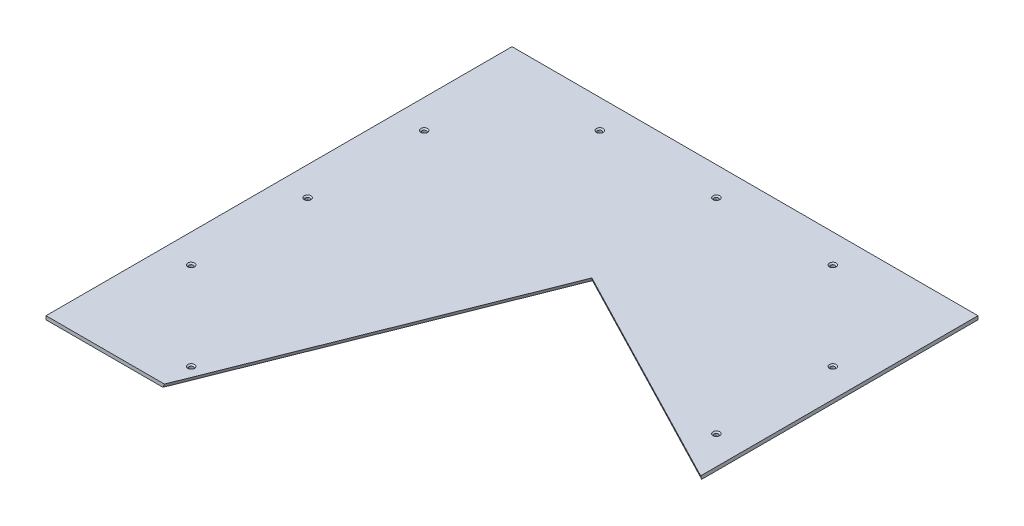
ISO-10303-21;
HEADER;
FILE_DESCRIPTION(('STEP AP214'),'2;1');
FILE_NAME('part.step','',(''),(''),'','','');
FILE_SCHEMA(('AUTOMOTIVE_DESIGN { 1 0 10303 214 1 1 1 1 }'));
ENDSEC;
DATA;
#1=APPLICATION_CONTEXT('core data for automotive mechanical design processes');
#2=APPLICATION_PROTOCOL_DEFINITION('international standard','automotive_design',2000,#1);
#3=PRODUCT_CONTEXT('',#1,'mechanical');
#4=PRODUCT('Part','Part','',(#3));
#5=PRODUCT_RELATED_PRODUCT_CATEGORY('part','',(#4));
#6=PRODUCT_DEFINITION_FORMATION('','',#4);
#7=PRODUCT_DEFINITION_CONTEXT('part definition',#1,'design');
#8=PRODUCT_DEFINITION('design','',#6,#7);
#9=PRODUCT_DEFINITION_SHAPE('','',#8);
#10=(LENGTH_UNIT() NAMED_UNIT(*) SI_UNIT(.MILLI.,.METRE.));
#11=(NAMED_UNIT(*) PLANE_ANGLE_UNIT() SI_UNIT($,.RADIAN.));
#12=(NAMED_UNIT(*) SI_UNIT($,.STERADIAN.) SOLID_ANGLE_UNIT());
#13=UNCERTAINTY_MEASURE_WITH_UNIT(LENGTH_MEASURE(1.E-05),#10,'distance_accuracy_value','');
#14=(GEOMETRIC_REPRESENTATION_CONTEXT(3) GLOBAL_UNCERTAINTY_ASSIGNED_CONTEXT((#13)) GLOBAL_UNIT_ASSIGNED_CONTEXT((#10,
#11,#12)) REPRESENTATION_CONTEXT('',''));
#15=CARTESIAN_POINT('',(0.,0.,0.));
#16=DIRECTION('',(0.,0.,1.));
#17=DIRECTION('',(1.,0.,0.));
#18=AXIS2_PLACEMENT_3D('',#15,#16,#17);
#19=CARTESIAN_POINT('',(103.375714,114.488214,103.375714));
#20=DIRECTION('',(1.,0.,0.));
#21=DIRECTION('',(0.,0.,1.));
#22=AXIS2_PLACEMENT_3D('',#19,#20,#21);
#23=PLANE('',#22);
#24=DIRECTION('',(0.,0.,1.));
#25=VECTOR('',#24,1.);
#26=CARTESIAN_POINT('',(103.375714,114.488214,103.375714));
#27=LINE('',#26,#25);
#28=CARTESIAN_POINT('',(103.375714,114.488214,-103.375714));
#29=VERTEX_POINT('',#28);
#30=CARTESIAN_POINT('',(103.375714,114.488214,19.666163495608));
#31=VERTEX_POINT('',#30);
#32=EDGE_CURVE('E193',#29,#31,#27,.T.);
#33=ORIENTED_EDGE('',*,*,#32,.T.);
#34=DIRECTION('',(0.,-0.961632224178945,-0.274341876899344));
#35=VECTOR('',#34,1.);
#36=CARTESIAN_POINT('',(103.375714,136.572131877508,25.9664343553739));
#37=LINE('',#36,#35);
#38=CARTESIAN_POINT('',(103.375714,112.900714,19.2132692199928));
#39=VERTEX_POINT('',#38);
#40=EDGE_CURVE('E95',#31,#39,#37,.T.);
#41=ORIENTED_EDGE('',*,*,#40,.T.);
#42=DIRECTION('',(0.,0.,1.));
#43=VECTOR('',#42,1.);
#44=CARTESIAN_POINT('',(103.375714,112.900714,103.375714));
#45=LINE('',#44,#43);
#46=CARTESIAN_POINT('',(103.375714,112.900714,-103.375714));
#47=VERTEX_POINT('',#46);
#48=EDGE_CURVE('E192',#47,#39,#45,.T.);
#49=ORIENTED_EDGE('',*,*,#48,.F.);
#50=DIRECTION('',(0.,-1.,0.));
#51=VECTOR('',#50,1.);
#52=CARTESIAN_POINT('',(103.375714,114.488214,-103.375714));
#53=LINE('',#52,#51);
#54=EDGE_CURVE('E55',#29,#47,#53,.T.);
#55=ORIENTED_EDGE('',*,*,#54,.F.);
#56=EDGE_LOOP('',(#33,#41,#49,#55));
#57=FACE_BOUND('',#56,.T.);
#58=ADVANCED_FACE('F32',(#57),#23,.T.);
#59=CARTESIAN_POINT('',(103.375714,114.488214,-103.375714));
#60=DIRECTION('',(0.,0.,-1.));
#61=DIRECTION('',(1.,0.,0.));
#62=AXIS2_PLACEMENT_3D('',#59,#60,#61);
#63=PLANE('',#62);
#64=DIRECTION('',(1.,0.,0.));
#65=VECTOR('',#64,1.);
#66=CARTESIAN_POINT('',(103.375714,112.900714,-103.375714));
#67=LINE('',#66,#65);
#68=CARTESIAN_POINT('',(-103.375714,112.900714,-103.375714));
#69=VERTEX_POINT('',#68);
#70=EDGE_CURVE('E195',#69,#47,#67,.T.);
#71=ORIENTED_EDGE('',*,*,#70,.F.);
#72=DIRECTION('',(0.,-1.,0.));
#73=VECTOR('',#72,1.);
#74=CARTESIAN_POINT('',(-103.375714,114.488214,-103.375714));
#75=LINE('',#74,#73);
#76=CARTESIAN_POINT('',(-103.375714,114.488214,-103.375714));
#77=VERTEX_POINT('',#76);
#78=EDGE_CURVE('E213',#77,#69,#75,.T.);
#79=ORIENTED_EDGE('',*,*,#78,.F.);
#80=DIRECTION('',(1.,0.,0.));
#81=VECTOR('',#80,1.);
#82=CARTESIAN_POINT('',(103.375714,114.488214,-103.375714));
#83=LINE('',#82,#81);
#84=EDGE_CURVE('E200',#77,#29,#83,.T.);
#85=ORIENTED_EDGE('',*,*,#84,.T.);
#86=ORIENTED_EDGE('',*,*,#54,.T.);
#87=EDGE_LOOP('',(#71,#79,#85,#86));
#88=FACE_BOUND('',#87,.T.);
#89=ADVANCED_FACE('F219',(#88),#63,.T.);
#90=CARTESIAN_POINT('',(-103.375714,114.488214,103.375714));
#91=DIRECTION('',(-1.,0.,0.));
#92=DIRECTION('',(0.,0.,-1.));
#93=AXIS2_PLACEMENT_3D('',#90,#91,#92);
#94=PLANE('',#93);
#95=DIRECTION('',(0.,0.,-1.));
#96=VECTOR('',#95,1.);
#97=CARTESIAN_POINT('',(-103.375714,112.900714,103.375714));
#98=LINE('',#97,#96);
#99=CARTESIAN_POINT('',(-103.375714,112.900714,103.375714));
#100=VERTEX_POINT('',#99);
#101=EDGE_CURVE('E207',#100,#69,#98,.T.);
#102=ORIENTED_EDGE('',*,*,#101,.F.);
#103=DIRECTION('',(0.,-1.,0.));
#104=VECTOR('',#103,1.);
#105=CARTESIAN_POINT('',(-103.375714,114.488214,103.375714));
#106=LINE('',#105,#104);
#107=CARTESIAN_POINT('',(-103.375714,114.488214,103.375714));
#108=VERTEX_POINT('',#107);
#109=EDGE_CURVE('E202',#108,#100,#106,.T.);
#110=ORIENTED_EDGE('',*,*,#109,.F.);
#111=DIRECTION('',(0.,0.,-1.));
#112=VECTOR('',#111,1.);
#113=CARTESIAN_POINT('',(-103.375714,114.488214,103.375714));
#114=LINE('',#113,#112);
#115=EDGE_CURVE('E197',#108,#77,#114,.T.);
#116=ORIENTED_EDGE('',*,*,#115,.T.);
#117=ORIENTED_EDGE('',*,*,#78,.T.);
#118=EDGE_LOOP('',(#102,#110,#116,#117));
#119=FACE_BOUND('',#118,.T.);
#120=ADVANCED_FACE('F222',(#119),#94,.T.);
#121=CARTESIAN_POINT('',(103.375714,114.488214,103.375714));
#122=DIRECTION('',(0.,0.,1.));
#123=DIRECTION('',(-1.,0.,0.));
#124=AXIS2_PLACEMENT_3D('',#121,#122,#123);
#125=PLANE('',#124);
#126=DIRECTION('',(-0.386214206739788,-0.922409121004534,0.));
#127=VECTOR('',#126,1.);
#128=CARTESIAN_POINT('',(-27.8368800868292,169.427141625007,103.375714));
#129=LINE('',#128,#127);
#130=CARTESIAN_POINT('',(-50.8398988869029,114.488214,103.375714));
#131=VERTEX_POINT('',#130);
#132=CARTESIAN_POINT('',(-51.5045877318395,112.900714,103.375714));
#133=VERTEX_POINT('',#132);
#134=EDGE_CURVE('E98',#131,#133,#129,.T.);
#135=ORIENTED_EDGE('',*,*,#134,.F.);
#136=DIRECTION('',(-1.,0.,0.));
#137=VECTOR('',#136,1.);
#138=CARTESIAN_POINT('',(103.375714,114.488214,103.375714));
#139=LINE('',#138,#137);
#140=EDGE_CURVE('E77',#131,#108,#139,.T.);
#141=ORIENTED_EDGE('',*,*,#140,.T.);
#142=ORIENTED_EDGE('',*,*,#109,.T.);
#143=DIRECTION('',(-1.,0.,0.));
#144=VECTOR('',#143,1.);
#145=CARTESIAN_POINT('',(103.375714,112.900714,103.375714));
#146=LINE('',#145,#144);
#147=EDGE_CURVE('E205',#133,#100,#146,.T.);
#148=ORIENTED_EDGE('',*,*,#147,.F.);
#149=EDGE_LOOP('',(#135,#141,#142,#148));
#150=FACE_BOUND('',#149,.T.);
#151=ADVANCED_FACE('F224',(#150),#125,.T.);
#152=CARTESIAN_POINT('',(103.375714,114.488214,-103.375714));
#153=DIRECTION('',(0.,1.,0.));
#154=DIRECTION('',(0.,0.,-1.));
#155=AXIS2_PLACEMENT_3D('',#152,#153,#154);
#156=PLANE('',#155);
#157=DIRECTION('',(-0.370324166908682,0.,0.928902584452961));
#158=VECTOR('',#157,1.);
#159=CARTESIAN_POINT('',(41.4307016373233,114.488214,-128.071236955042));
#160=LINE('',#159,#158);
#161=CARTESIAN_POINT('',(3.2203230563699,114.488214,-32.2262379287537));
#162=VERTEX_POINT('',#161);
#163=EDGE_CURVE('E102',#162,#131,#160,.T.);
#164=ORIENTED_EDGE('',*,*,#163,.F.);
#165=DIRECTION('',(0.887899482968571,0.,0.460037507323201));
#166=VECTOR('',#165,1.);
#167=CARTESIAN_POINT('',(53.117159439778,114.488214,-6.37374372930703));
#168=LINE('',#167,#166);
#169=EDGE_CURVE('E92',#162,#31,#168,.T.);
#170=ORIENTED_EDGE('',*,*,#169,.T.);
#171=ORIENTED_EDGE('',*,*,#32,.F.);
#172=ORIENTED_EDGE('',*,*,#84,.F.);
#173=ORIENTED_EDGE('',*,*,#115,.F.);
#174=ORIENTED_EDGE('',*,*,#140,.F.);
#175=EDGE_LOOP('',(#164,#170,#171,#172,#173,#174));
#176=FACE_BOUND('',#175,.T.);
#177=CARTESIAN_POINT('',(-90.6757140000005,114.488214,51.6878569999991));
#178=DIRECTION('',(0.,1.,0.));
#179=DIRECTION('',(0.,0.,-1.));
#180=AXIS2_PLACEMENT_3D('',#177,#178,#179);
#181=CIRCLE('',#180,1.51130000000001);
#182=CARTESIAN_POINT('',(-90.6757140000005,114.488214,50.1765569999991));
#183=VERTEX_POINT('',#182);
#184=EDGE_CURVE('E108',#183,#183,#181,.T.);
#185=ORIENTED_EDGE('',*,*,#184,.F.);
#186=EDGE_LOOP('',(#185));
#187=FACE_BOUND('',#186,.T.);
#188=CARTESIAN_POINT('',(-90.675714,114.488214,-9.36190769008373E-13));
#189=DIRECTION('',(0.,1.,0.));
#190=DIRECTION('',(0.,0.,-1.));
#191=AXIS2_PLACEMENT_3D('',#188,#189,#190);
#192=CIRCLE('',#191,1.51129999999999);
#193=CARTESIAN_POINT('',(-90.675714,114.488214,-1.51130000000093));
#194=VERTEX_POINT('',#193);
#195=EDGE_CURVE('E120',#194,#194,#192,.T.);
#196=ORIENTED_EDGE('',*,*,#195,.F.);
#197=EDGE_LOOP('',(#196));
#198=FACE_BOUND('',#197,.T.);
#199=CARTESIAN_POINT('',(-90.6757139999995,114.488214,-51.687857000001));
#200=DIRECTION('',(0.,1.,0.));
#201=DIRECTION('',(0.,0.,-1.));
#202=AXIS2_PLACEMENT_3D('',#199,#200,#201);
#203=CIRCLE('',#202,1.51129999999999);
#204=CARTESIAN_POINT('',(-90.6757139999995,114.488214,-53.1991570000009));
#205=VERTEX_POINT('',#204);
#206=EDGE_CURVE('E129',#205,#205,#203,.T.);
#207=ORIENTED_EDGE('',*,*,#206,.F.);
#208=EDGE_LOOP('',(#207));
#209=FACE_BOUND('',#208,.T.);
#210=CARTESIAN_POINT('',(-51.6878570000006,114.488214,90.6757139999997));
#211=DIRECTION('',(0.,1.,0.));
#212=DIRECTION('',(0.,0.,-1.));
#213=AXIS2_PLACEMENT_3D('',#210,#211,#212);
#214=CIRCLE('',#213,1.5113);
#215=CARTESIAN_POINT('',(-51.6878570000006,114.488214,89.1644139999997));
#216=VERTEX_POINT('',#215);
#217=EDGE_CURVE('E138',#216,#216,#214,.T.);
#218=ORIENTED_EDGE('',*,*,#217,.F.);
#219=EDGE_LOOP('',(#218));
#220=FACE_BOUND('',#219,.T.);
#221=CARTESIAN_POINT('',(90.6757140000002,114.488214,-51.6878569999997));
#222=DIRECTION('',(0.,1.,0.));
#223=DIRECTION('',(0.,0.,-1.));
#224=AXIS2_PLACEMENT_3D('',#221,#222,#223);
#225=CIRCLE('',#224,1.51130000000001);
#226=CARTESIAN_POINT('',(90.6757140000002,114.488214,-53.1991569999997));
#227=VERTEX_POINT('',#226);
#228=EDGE_CURVE('E147',#227,#227,#225,.T.);
#229=ORIENTED_EDGE('',*,*,#228,.F.);
#230=EDGE_LOOP('',(#229));
#231=FACE_BOUND('',#230,.T.);
#232=CARTESIAN_POINT('',(90.675714,114.488214,3.03005275632947E-13));
#233=DIRECTION('',(0.,1.,0.));
#234=DIRECTION('',(0.,0.,-1.));
#235=AXIS2_PLACEMENT_3D('',#232,#233,#234);
#236=CIRCLE('',#235,1.51129999999999);
#237=CARTESIAN_POINT('',(90.675714,114.488214,-1.51129999999969));
#238=VERTEX_POINT('',#237);
#239=EDGE_CURVE('E156',#238,#238,#236,.T.);
#240=ORIENTED_EDGE('',*,*,#239,.F.);
#241=EDGE_LOOP('',(#240));
#242=FACE_BOUND('',#241,.T.);
#243=CARTESIAN_POINT('',(-51.687857,114.488214,-90.675714));
#244=DIRECTION('',(0.,1.,0.));
#245=DIRECTION('',(0.,0.,-1.));
#246=AXIS2_PLACEMENT_3D('',#243,#244,#245);
#247=CIRCLE('',#246,1.5113);
#248=CARTESIAN_POINT('',(-51.687857,114.488214,-92.187014));
#249=VERTEX_POINT('',#248);
#250=EDGE_CURVE('E165',#249,#249,#247,.T.);
#251=ORIENTED_EDGE('',*,*,#250,.F.);
#252=EDGE_LOOP('',(#251));
#253=FACE_BOUND('',#252,.T.);
#254=CARTESIAN_POINT('',(0.,114.488214,-90.675714));
#255=DIRECTION('',(0.,1.,0.));
#256=DIRECTION('',(0.,0.,-1.));
#257=AXIS2_PLACEMENT_3D('',#254,#255,#256);
#258=CIRCLE('',#257,1.5113);
#259=CARTESIAN_POINT('',(0.,114.488214,-92.187014));
#260=VERTEX_POINT('',#259);
#261=EDGE_CURVE('E174',#260,#260,#258,.T.);
#262=ORIENTED_EDGE('',*,*,#261,.F.);
#263=EDGE_LOOP('',(#262));
#264=FACE_BOUND('',#263,.T.);
#265=CARTESIAN_POINT('',(51.687857,114.488214,-90.675714));
#266=DIRECTION('',(0.,1.,0.));
#267=DIRECTION('',(0.,0.,-1.));
#268=AXIS2_PLACEMENT_3D('',#265,#266,#267);
#269=CIRCLE('',#268,1.5113);
#270=CARTESIAN_POINT('',(51.687857,114.488214,-92.187014));
#271=VERTEX_POINT('',#270);
#272=EDGE_CURVE('E183',#271,#271,#269,.T.);
#273=ORIENTED_EDGE('',*,*,#272,.F.);
#274=EDGE_LOOP('',(#273));
#275=FACE_BOUND('',#274,.T.);
#276=ADVANCED_FACE('F105',(#176,#187,#198,#209,#220,#231,#242,#253,#264,#275),#156,.T.);
#277=CARTESIAN_POINT('',(103.375714,112.900714,-103.375714));
#278=DIRECTION('',(0.,1.,0.));
#279=DIRECTION('',(0.,0.,-1.));
#280=AXIS2_PLACEMENT_3D('',#277,#278,#279);
#281=PLANE('',#280);
#282=CARTESIAN_POINT('',(-90.6757140000005,112.900714,51.6878569999991));
#283=DIRECTION('',(0.,1.,0.));
#284=DIRECTION('',(0.,0.,-1.));
#285=AXIS2_PLACEMENT_3D('',#282,#283,#284);
#286=CIRCLE('',#285,0.889000000000001);
#287=CARTESIAN_POINT('',(-90.6757140000005,112.900714,50.7988569999991));
#288=VERTEX_POINT('',#287);
#289=EDGE_CURVE('E117',#288,#288,#286,.T.);
#290=ORIENTED_EDGE('',*,*,#289,.T.);
#291=EDGE_LOOP('',(#290));
#292=FACE_BOUND('',#291,.T.);
#293=CARTESIAN_POINT('',(-90.675714,112.900714,-9.36190769008373E-13));
#294=DIRECTION('',(0.,1.,0.));
#295=DIRECTION('',(0.,0.,-1.));
#296=AXIS2_PLACEMENT_3D('',#293,#294,#295);
#297=CIRCLE('',#296,0.889000000000001);
#298=CARTESIAN_POINT('',(-90.675714,112.900714,-0.889000000000937));
#299=VERTEX_POINT('',#298);
#300=EDGE_CURVE('E126',#299,#299,#297,.T.);
#301=ORIENTED_EDGE('',*,*,#300,.T.);
#302=EDGE_LOOP('',(#301));
#303=FACE_BOUND('',#302,.T.);
#304=CARTESIAN_POINT('',(-90.6757139999995,112.900714,-51.687857000001));
#305=DIRECTION('',(0.,1.,0.));
#306=DIRECTION('',(0.,0.,-1.));
#307=AXIS2_PLACEMENT_3D('',#304,#305,#306);
#308=CIRCLE('',#307,0.889000000000001);
#309=CARTESIAN_POINT('',(-90.6757139999995,112.900714,-52.576857000001));
#310=VERTEX_POINT('',#309);
#311=EDGE_CURVE('E135',#310,#310,#308,.T.);
#312=ORIENTED_EDGE('',*,*,#311,.T.);
#313=EDGE_LOOP('',(#312));
#314=FACE_BOUND('',#313,.T.);
#315=CARTESIAN_POINT('',(-51.6878570000006,112.900714,90.6757139999997));
#316=DIRECTION('',(0.,1.,0.));
#317=DIRECTION('',(0.,0.,-1.));
#318=AXIS2_PLACEMENT_3D('',#315,#316,#317);
#319=CIRCLE('',#318,0.889000000000001);
#320=CARTESIAN_POINT('',(-51.6878570000006,112.900714,89.7867139999997));
#321=VERTEX_POINT('',#320);
#322=EDGE_CURVE('E144',#321,#321,#319,.T.);
#323=ORIENTED_EDGE('',*,*,#322,.T.);
#324=EDGE_LOOP('',(#323));
#325=FACE_BOUND('',#324,.T.);
#326=CARTESIAN_POINT('',(90.6757140000002,112.900714,-51.6878569999997));
#327=DIRECTION('',(0.,1.,0.));
#328=DIRECTION('',(0.,0.,-1.));
#329=AXIS2_PLACEMENT_3D('',#326,#327,#328);
#330=CIRCLE('',#329,0.889000000000001);
#331=CARTESIAN_POINT('',(90.6757140000002,112.900714,-52.5768569999997));
#332=VERTEX_POINT('',#331);
#333=EDGE_CURVE('E153',#332,#332,#330,.T.);
#334=ORIENTED_EDGE('',*,*,#333,.T.);
#335=EDGE_LOOP('',(#334));
#336=FACE_BOUND('',#335,.T.);
#337=CARTESIAN_POINT('',(90.675714,112.900714,3.03005275632947E-13));
#338=DIRECTION('',(0.,1.,0.));
#339=DIRECTION('',(0.,0.,-1.));
#340=AXIS2_PLACEMENT_3D('',#337,#338,#339);
#341=CIRCLE('',#340,0.889000000000001);
#342=CARTESIAN_POINT('',(90.675714,112.900714,-0.888999999999698));
#343=VERTEX_POINT('',#342);
#344=EDGE_CURVE('E162',#343,#343,#341,.T.);
#345=ORIENTED_EDGE('',*,*,#344,.T.);
#346=EDGE_LOOP('',(#345));
#347=FACE_BOUND('',#346,.T.);
#348=CARTESIAN_POINT('',(-51.687857,112.900714,-90.675714));
#349=DIRECTION('',(0.,1.,0.));
#350=DIRECTION('',(0.,0.,-1.));
#351=AXIS2_PLACEMENT_3D('',#348,#349,#350);
#352=CIRCLE('',#351,0.889000000000001);
#353=CARTESIAN_POINT('',(-51.687857,112.900714,-91.564714));
#354=VERTEX_POINT('',#353);
#355=EDGE_CURVE('E171',#354,#354,#352,.T.);
#356=ORIENTED_EDGE('',*,*,#355,.T.);
#357=EDGE_LOOP('',(#356));
#358=FACE_BOUND('',#357,.T.);
#359=CARTESIAN_POINT('',(0.,112.900714,-90.675714));
#360=DIRECTION('',(0.,1.,0.));
#361=DIRECTION('',(0.,0.,-1.));
#362=AXIS2_PLACEMENT_3D('',#359,#360,#361);
#363=CIRCLE('',#362,0.889);
#364=CARTESIAN_POINT('',(0.,112.900714,-91.564714));
#365=VERTEX_POINT('',#364);
#366=EDGE_CURVE('E180',#365,#365,#363,.T.);
#367=ORIENTED_EDGE('',*,*,#366,.T.);
#368=EDGE_LOOP('',(#367));
#369=FACE_BOUND('',#368,.T.);
#370=CARTESIAN_POINT('',(51.687857,112.900714,-90.675714));
#371=DIRECTION('',(0.,1.,0.));
#372=DIRECTION('',(0.,0.,-1.));
#373=AXIS2_PLACEMENT_3D('',#370,#371,#372);
#374=CIRCLE('',#373,0.889000000000001);
#375=CARTESIAN_POINT('',(51.687857,112.900714,-91.564714));
#376=VERTEX_POINT('',#375);
#377=EDGE_CURVE('E189',#376,#376,#374,.T.);
#378=ORIENTED_EDGE('',*,*,#377,.T.);
#379=EDGE_LOOP('',(#378));
#380=FACE_BOUND('',#379,.T.);
#381=DIRECTION('',(0.887899482968571,0.,0.460037507323201));
#382=VECTOR('',#381,1.);
#383=CARTESIAN_POINT('',(53.3021518352478,112.900714,-6.73078994766108));
#384=LINE('',#383,#382);
#385=CARTESIAN_POINT('',(2.8190706401824,112.900714,-32.8870286666273));
#386=VERTEX_POINT('',#385);
#387=EDGE_CURVE('E39',#386,#39,#384,.T.);
#388=ORIENTED_EDGE('',*,*,#387,.F.);
#389=DIRECTION('',(-0.370324166908682,0.,0.928902584452961));
#390=VECTOR('',#389,1.);
#391=CARTESIAN_POINT('',(40.8571682130017,112.900714,-128.299886644591));
#392=LINE('',#391,#390);
#393=EDGE_CURVE('E11',#386,#133,#392,.T.);
#394=ORIENTED_EDGE('',*,*,#393,.T.);
#395=ORIENTED_EDGE('',*,*,#147,.T.);
#396=ORIENTED_EDGE('',*,*,#101,.T.);
#397=ORIENTED_EDGE('',*,*,#70,.T.);
#398=ORIENTED_EDGE('',*,*,#48,.T.);
#399=EDGE_LOOP('',(#388,#394,#395,#396,#397,#398));
#400=FACE_BOUND('',#399,.T.);
#401=ADVANCED_FACE('F217',(#292,#303,#314,#325,#336,#347,#358,#369,#380,#400),#281,.F.);
#402=CARTESIAN_POINT('',(51.687857,114.488214,-90.675714));
#403=DIRECTION('',(0.,1.,0.));
#404=DIRECTION('',(0.,0.,-1.));
#405=AXIS2_PLACEMENT_3D('',#402,#403,#404);
#406=CYLINDRICAL_SURFACE('',#405,0.888999999999997);
#407=ORIENTED_EDGE('',*,*,#377,.F.);
#408=EDGE_LOOP('',(#407));
#409=FACE_BOUND('',#408,.T.);
#410=CARTESIAN_POINT('',(51.687857,113.966042299518,-90.675714));
#411=DIRECTION('',(0.,1.,0.));
#412=DIRECTION('',(0.,0.,-1.));
#413=AXIS2_PLACEMENT_3D('',#410,#411,#412);
#414=CIRCLE('',#413,0.888999999999994);
#415=CARTESIAN_POINT('',(51.687857,113.966042299518,-91.564714));
#416=VERTEX_POINT('',#415);
#417=EDGE_CURVE('E186',#416,#416,#414,.T.);
#418=ORIENTED_EDGE('',*,*,#417,.T.);
#419=EDGE_LOOP('',(#418));
#420=FACE_BOUND('',#419,.T.);
#421=ADVANCED_FACE('F241',(#409,#420),#406,.F.);
#422=CARTESIAN_POINT('',(51.687857,114.488214,-90.675714));
#423=DIRECTION('',(0.,1.,0.));
#424=DIRECTION('',(0.,0.,-1.));
#425=AXIS2_PLACEMENT_3D('',#422,#423,#424);
#426=CONICAL_SURFACE('',#425,1.5113,0.872664625997172);
#427=ORIENTED_EDGE('',*,*,#417,.F.);
#428=EDGE_LOOP('',(#427));
#429=FACE_BOUND('',#428,.T.);
#430=ORIENTED_EDGE('',*,*,#272,.T.);
#431=EDGE_LOOP('',(#430));
#432=FACE_BOUND('',#431,.T.);
#433=ADVANCED_FACE('F246',(#429,#432),#426,.F.);
#434=CARTESIAN_POINT('',(0.,114.488214,-90.675714));
#435=DIRECTION('',(0.,1.,0.));
#436=DIRECTION('',(0.,0.,-1.));
#437=AXIS2_PLACEMENT_3D('',#434,#435,#436);
#438=CYLINDRICAL_SURFACE('',#437,0.888999999999998);
#439=ORIENTED_EDGE('',*,*,#366,.F.);
#440=EDGE_LOOP('',(#439));
#441=FACE_BOUND('',#440,.T.);
#442=CARTESIAN_POINT('',(0.,113.966042299518,-90.675714));
#443=DIRECTION('',(0.,1.,0.));
#444=DIRECTION('',(0.,0.,-1.));
#445=AXIS2_PLACEMENT_3D('',#442,#443,#444);
#446=CIRCLE('',#445,0.888999999999997);
#447=CARTESIAN_POINT('',(0.,113.966042299518,-91.564714));
#448=VERTEX_POINT('',#447);
#449=EDGE_CURVE('E177',#448,#448,#446,.T.);
#450=ORIENTED_EDGE('',*,*,#449,.T.);
#451=EDGE_LOOP('',(#450));
#452=FACE_BOUND('',#451,.T.);
#453=ADVANCED_FACE('F250',(#441,#452),#438,.F.);
#454=CARTESIAN_POINT('',(0.,114.488214,-90.675714));
#455=DIRECTION('',(0.,1.,0.));
#456=DIRECTION('',(0.,0.,-1.));
#457=AXIS2_PLACEMENT_3D('',#454,#455,#456);
#458=CONICAL_SURFACE('',#457,1.5113,0.87266462599717);
#459=ORIENTED_EDGE('',*,*,#449,.F.);
#460=EDGE_LOOP('',(#459));
#461=FACE_BOUND('',#460,.T.);
#462=ORIENTED_EDGE('',*,*,#261,.T.);
#463=EDGE_LOOP('',(#462));
#464=FACE_BOUND('',#463,.T.);
#465=ADVANCED_FACE('F254',(#461,#464),#458,.F.);
#466=CARTESIAN_POINT('',(-51.687857,114.488214,-90.675714));
#467=DIRECTION('',(0.,1.,0.));
#468=DIRECTION('',(0.,0.,-1.));
#469=AXIS2_PLACEMENT_3D('',#466,#467,#468);
#470=CYLINDRICAL_SURFACE('',#469,0.888999999999997);
#471=ORIENTED_EDGE('',*,*,#355,.F.);
#472=EDGE_LOOP('',(#471));
#473=FACE_BOUND('',#472,.T.);
#474=CARTESIAN_POINT('',(-51.687857,113.966042299518,-90.675714));
#475=DIRECTION('',(0.,1.,0.));
#476=DIRECTION('',(0.,0.,-1.));
#477=AXIS2_PLACEMENT_3D('',#474,#475,#476);
#478=CIRCLE('',#477,0.888999999999994);
#479=CARTESIAN_POINT('',(-51.687857,113.966042299518,-91.564714));
#480=VERTEX_POINT('',#479);
#481=EDGE_CURVE('E168',#480,#480,#478,.T.);
#482=ORIENTED_EDGE('',*,*,#481,.T.);
#483=EDGE_LOOP('',(#482));
#484=FACE_BOUND('',#483,.T.);
#485=ADVANCED_FACE('F258',(#473,#484),#470,.F.);
#486=CARTESIAN_POINT('',(-51.687857,114.488214,-90.675714));
#487=DIRECTION('',(0.,1.,0.));
#488=DIRECTION('',(0.,0.,-1.));
#489=AXIS2_PLACEMENT_3D('',#486,#487,#488);
#490=CONICAL_SURFACE('',#489,1.5113,0.872664625997172);
#491=ORIENTED_EDGE('',*,*,#481,.F.);
#492=EDGE_LOOP('',(#491));
#493=FACE_BOUND('',#492,.T.);
#494=ORIENTED_EDGE('',*,*,#250,.T.);
#495=EDGE_LOOP('',(#494));
#496=FACE_BOUND('',#495,.T.);
#497=ADVANCED_FACE('F262',(#493,#496),#490,.F.);
#498=CARTESIAN_POINT('',(90.675714,114.488214,3.03005275632947E-13));
#499=DIRECTION('',(0.,1.,0.));
#500=DIRECTION('',(0.,0.,-1.));
#501=AXIS2_PLACEMENT_3D('',#498,#499,#500);
#502=CYLINDRICAL_SURFACE('',#501,0.889000000000001);
#503=ORIENTED_EDGE('',*,*,#344,.F.);
#504=EDGE_LOOP('',(#503));
#505=FACE_BOUND('',#504,.T.);
#506=CARTESIAN_POINT('',(90.675714,113.966042299518,3.03005275632947E-13));
#507=DIRECTION('',(0.,1.,0.));
#508=DIRECTION('',(0.,0.,-1.));
#509=AXIS2_PLACEMENT_3D('',#506,#507,#508);
#510=CIRCLE('',#509,0.889000000000001);
#511=CARTESIAN_POINT('',(90.675714,113.966042299518,-0.888999999999698));
#512=VERTEX_POINT('',#511);
#513=EDGE_CURVE('E159',#512,#512,#510,.T.);
#514=ORIENTED_EDGE('',*,*,#513,.T.);
#515=EDGE_LOOP('',(#514));
#516=FACE_BOUND('',#515,.T.);
#517=ADVANCED_FACE('F266',(#505,#516),#502,.F.);
#518=CARTESIAN_POINT('',(90.675714,114.488214,3.03005275632947E-13));
#519=DIRECTION('',(0.,1.,0.));
#520=DIRECTION('',(0.,0.,-1.));
#521=AXIS2_PLACEMENT_3D('',#518,#519,#520);
#522=CONICAL_SURFACE('',#521,1.51129999999999,0.872664625997161);
#523=ORIENTED_EDGE('',*,*,#513,.F.);
#524=EDGE_LOOP('',(#523));
#525=FACE_BOUND('',#524,.T.);
#526=ORIENTED_EDGE('',*,*,#239,.T.);
#527=EDGE_LOOP('',(#526));
#528=FACE_BOUND('',#527,.T.);
#529=ADVANCED_FACE('F270',(#525,#528),#522,.F.);
#530=CARTESIAN_POINT('',(90.6757140000002,114.488214,-51.6878569999997));
#531=DIRECTION('',(0.,1.,0.));
#532=DIRECTION('',(0.,0.,-1.));
#533=AXIS2_PLACEMENT_3D('',#530,#531,#532);
#534=CYLINDRICAL_SURFACE('',#533,0.889000000000001);
#535=ORIENTED_EDGE('',*,*,#333,.F.);
#536=EDGE_LOOP('',(#535));
#537=FACE_BOUND('',#536,.T.);
#538=CARTESIAN_POINT('',(90.6757140000002,113.966042299518,-51.6878569999997));
#539=DIRECTION('',(0.,1.,0.));
#540=DIRECTION('',(0.,0.,-1.));
#541=AXIS2_PLACEMENT_3D('',#538,#539,#540);
#542=CIRCLE('',#541,0.889000000000001);
#543=CARTESIAN_POINT('',(90.6757140000002,113.966042299518,-52.5768569999997));
#544=VERTEX_POINT('',#543);
#545=EDGE_CURVE('E150',#544,#544,#542,.T.);
#546=ORIENTED_EDGE('',*,*,#545,.T.);
#547=EDGE_LOOP('',(#546));
#548=FACE_BOUND('',#547,.T.);
#549=ADVANCED_FACE('F274',(#537,#548),#534,.F.);
#550=CARTESIAN_POINT('',(90.6757140000002,114.488214,-51.6878569999997));
#551=DIRECTION('',(0.,1.,0.));
#552=DIRECTION('',(0.,0.,-1.));
#553=AXIS2_PLACEMENT_3D('',#550,#551,#552);
#554=CONICAL_SURFACE('',#553,1.51130000000001,0.872664625997172);
#555=ORIENTED_EDGE('',*,*,#545,.F.);
#556=EDGE_LOOP('',(#555));
#557=FACE_BOUND('',#556,.T.);
#558=ORIENTED_EDGE('',*,*,#228,.T.);
#559=EDGE_LOOP('',(#558));
#560=FACE_BOUND('',#559,.T.);
#561=ADVANCED_FACE('F278',(#557,#560),#554,.F.);
#562=CARTESIAN_POINT('',(-51.6878570000006,114.488214,90.6757139999997));
#563=DIRECTION('',(0.,1.,0.));
#564=DIRECTION('',(0.,0.,-1.));
#565=AXIS2_PLACEMENT_3D('',#562,#563,#564);
#566=CYLINDRICAL_SURFACE('',#565,0.888999999999997);
#567=ORIENTED_EDGE('',*,*,#322,.F.);
#568=EDGE_LOOP('',(#567));
#569=FACE_BOUND('',#568,.T.);
#570=CARTESIAN_POINT('',(-51.6878570000006,113.966042299518,90.6757139999997));
#571=DIRECTION('',(0.,1.,0.));
#572=DIRECTION('',(0.,0.,-1.));
#573=AXIS2_PLACEMENT_3D('',#570,#571,#572);
#574=CIRCLE('',#573,0.888999999999994);
#575=CARTESIAN_POINT('',(-51.6878570000006,113.966042299518,89.7867139999997));
#576=VERTEX_POINT('',#575);
#577=EDGE_CURVE('E141',#576,#576,#574,.T.);
#578=ORIENTED_EDGE('',*,*,#577,.T.);
#579=EDGE_LOOP('',(#578));
#580=FACE_BOUND('',#579,.T.);
#581=ADVANCED_FACE('F282',(#569,#580),#566,.F.);
#582=CARTESIAN_POINT('',(-51.6878570000006,114.488214,90.6757139999997));
#583=DIRECTION('',(0.,1.,0.));
#584=DIRECTION('',(0.,0.,-1.));
#585=AXIS2_PLACEMENT_3D('',#582,#583,#584);
#586=CONICAL_SURFACE('',#585,1.5113,0.872664625997172);
#587=ORIENTED_EDGE('',*,*,#577,.F.);
#588=EDGE_LOOP('',(#587));
#589=FACE_BOUND('',#588,.T.);
#590=ORIENTED_EDGE('',*,*,#217,.T.);
#591=EDGE_LOOP('',(#590));
#592=FACE_BOUND('',#591,.T.);
#593=ADVANCED_FACE('F286',(#589,#592),#586,.F.);
#594=CARTESIAN_POINT('',(-90.6757139999995,114.488214,-51.687857000001));
#595=DIRECTION('',(0.,1.,0.));
#596=DIRECTION('',(0.,0.,-1.));
#597=AXIS2_PLACEMENT_3D('',#594,#595,#596);
#598=CYLINDRICAL_SURFACE('',#597,0.889000000000001);
#599=ORIENTED_EDGE('',*,*,#311,.F.);
#600=EDGE_LOOP('',(#599));
#601=FACE_BOUND('',#600,.T.);
#602=CARTESIAN_POINT('',(-90.6757139999995,113.966042299518,-51.687857000001));
#603=DIRECTION('',(0.,1.,0.));
#604=DIRECTION('',(0.,0.,-1.));
#605=AXIS2_PLACEMENT_3D('',#602,#603,#604);
#606=CIRCLE('',#605,0.889000000000001);
#607=CARTESIAN_POINT('',(-90.6757139999995,113.966042299518,-52.576857000001));
#608=VERTEX_POINT('',#607);
#609=EDGE_CURVE('E132',#608,#608,#606,.T.);
#610=ORIENTED_EDGE('',*,*,#609,.T.);
#611=EDGE_LOOP('',(#610));
#612=FACE_BOUND('',#611,.T.);
#613=ADVANCED_FACE('F290',(#601,#612),#598,.F.);
#614=CARTESIAN_POINT('',(-90.6757139999995,114.488214,-51.687857000001));
#615=DIRECTION('',(0.,1.,0.));
#616=DIRECTION('',(0.,0.,-1.));
#617=AXIS2_PLACEMENT_3D('',#614,#615,#616);
#618=CONICAL_SURFACE('',#617,1.51129999999999,0.872664625997161);
#619=ORIENTED_EDGE('',*,*,#609,.F.);
#620=EDGE_LOOP('',(#619));
#621=FACE_BOUND('',#620,.T.);
#622=ORIENTED_EDGE('',*,*,#206,.T.);
#623=EDGE_LOOP('',(#622));
#624=FACE_BOUND('',#623,.T.);
#625=ADVANCED_FACE('F294',(#621,#624),#618,.F.);
#626=CARTESIAN_POINT('',(-90.675714,114.488214,-9.36190769008373E-13));
#627=DIRECTION('',(0.,1.,0.));
#628=DIRECTION('',(0.,0.,-1.));
#629=AXIS2_PLACEMENT_3D('',#626,#627,#628);
#630=CYLINDRICAL_SURFACE('',#629,0.889000000000001);
#631=ORIENTED_EDGE('',*,*,#300,.F.);
#632=EDGE_LOOP('',(#631));
#633=FACE_BOUND('',#632,.T.);
#634=CARTESIAN_POINT('',(-90.675714,113.966042299518,-9.36190769008373E-13));
#635=DIRECTION('',(0.,1.,0.));
#636=DIRECTION('',(0.,0.,-1.));
#637=AXIS2_PLACEMENT_3D('',#634,#635,#636);
#638=CIRCLE('',#637,0.889000000000001);
#639=CARTESIAN_POINT('',(-90.675714,113.966042299518,-0.889000000000937));
#640=VERTEX_POINT('',#639);
#641=EDGE_CURVE('E123',#640,#640,#638,.T.);
#642=ORIENTED_EDGE('',*,*,#641,.T.);
#643=EDGE_LOOP('',(#642));
#644=FACE_BOUND('',#643,.T.);
#645=ADVANCED_FACE('F298',(#633,#644),#630,.F.);
#646=CARTESIAN_POINT('',(-90.675714,114.488214,-9.36190769008373E-13));
#647=DIRECTION('',(0.,1.,0.));
#648=DIRECTION('',(0.,0.,-1.));
#649=AXIS2_PLACEMENT_3D('',#646,#647,#648);
#650=CONICAL_SURFACE('',#649,1.51129999999999,0.872664625997161);
#651=ORIENTED_EDGE('',*,*,#641,.F.);
#652=EDGE_LOOP('',(#651));
#653=FACE_BOUND('',#652,.T.);
#654=ORIENTED_EDGE('',*,*,#195,.T.);
#655=EDGE_LOOP('',(#654));
#656=FACE_BOUND('',#655,.T.);
#657=ADVANCED_FACE('F302',(#653,#656),#650,.F.);
#658=CARTESIAN_POINT('',(-90.6757140000005,114.488214,51.6878569999991));
#659=DIRECTION('',(0.,1.,0.));
#660=DIRECTION('',(0.,0.,-1.));
#661=AXIS2_PLACEMENT_3D('',#658,#659,#660);
#662=CYLINDRICAL_SURFACE('',#661,0.889000000000001);
#663=ORIENTED_EDGE('',*,*,#289,.F.);
#664=EDGE_LOOP('',(#663));
#665=FACE_BOUND('',#664,.T.);
#666=CARTESIAN_POINT('',(-90.6757140000005,113.966042299518,51.6878569999991));
#667=DIRECTION('',(0.,1.,0.));
#668=DIRECTION('',(0.,0.,-1.));
#669=AXIS2_PLACEMENT_3D('',#666,#667,#668);
#670=CIRCLE('',#669,0.889000000000001);
#671=CARTESIAN_POINT('',(-90.6757140000005,113.966042299518,50.7988569999991));
#672=VERTEX_POINT('',#671);
#673=EDGE_CURVE('E111',#672,#672,#670,.T.);
#674=ORIENTED_EDGE('',*,*,#673,.T.);
#675=EDGE_LOOP('',(#674));
#676=FACE_BOUND('',#675,.T.);
#677=ADVANCED_FACE('F306',(#665,#676),#662,.F.);
#678=CARTESIAN_POINT('',(-90.6757140000005,114.488214,51.6878569999991));
#679=DIRECTION('',(0.,1.,0.));
#680=DIRECTION('',(0.,0.,-1.));
#681=AXIS2_PLACEMENT_3D('',#678,#679,#680);
#682=CONICAL_SURFACE('',#681,1.51130000000001,0.872664625997172);
#683=ORIENTED_EDGE('',*,*,#673,.F.);
#684=EDGE_LOOP('',(#683));
#685=FACE_BOUND('',#684,.T.);
#686=ORIENTED_EDGE('',*,*,#184,.T.);
#687=EDGE_LOOP('',(#686));
#688=FACE_BOUND('',#687,.T.);
#689=ADVANCED_FACE('F310',(#685,#688),#682,.F.);
#690=CARTESIAN_POINT('',(34.8794305366205,239.743118636919,19.91063190263));
#691=DIRECTION('',(-0.865728638508029,0.362481996068263,-0.345138706889568));
#692=DIRECTION('',(-0.386214206739788,-0.922409121004533,0.));
#693=AXIS2_PLACEMENT_3D('',#690,#691,#692);
#694=PLANE('',#693);
#695=ORIENTED_EDGE('',*,*,#163,.T.);
#696=ORIENTED_EDGE('',*,*,#134,.T.);
#697=ORIENTED_EDGE('',*,*,#393,.F.);
#698=DIRECTION('',(-0.22724442901572,-0.899061330247256,-0.374230803028497));
#699=VECTOR('',#698,1.);
#700=CARTESIAN_POINT('',(34.8794305366205,239.743118636919,19.91063190263));
#701=LINE('',#700,#699);
#702=EDGE_CURVE('E46',#162,#386,#701,.T.);
#703=ORIENTED_EDGE('',*,*,#702,.F.);
#704=EDGE_LOOP('',(#695,#696,#697,#703));
#705=FACE_BOUND('',#704,.T.);
#706=ADVANCED_FACE('F101',(#705),#694,.F.);
#707=CARTESIAN_POINT('',(-8.30044554866632,68.9078774769947,-51.1988767971413));
#708=DIRECTION('',(-0.445952793407951,-0.245551475215283,0.860715155595185));
#709=DIRECTION('',(0.887899482968571,0.,0.460037507323201));
#710=AXIS2_PLACEMENT_3D('',#707,#708,#709);
#711=PLANE('',#710);
#712=ORIENTED_EDGE('',*,*,#702,.T.);
#713=ORIENTED_EDGE('',*,*,#387,.T.);
#714=ORIENTED_EDGE('',*,*,#40,.F.);
#715=ORIENTED_EDGE('',*,*,#169,.F.);
#716=EDGE_LOOP('',(#712,#713,#714,#715));
#717=FACE_BOUND('',#716,.T.);
#718=ADVANCED_FACE('F93',(#717),#711,.T.);
#719=CLOSED_SHELL('',(#58,#89,#120,#151,#276,#401,#421,#433,#453,#465,#485,#497,#517,#529,#549,
#561,#581,#593,#613,#625,#645,#657,#677,#689,#706,#718));
#720=MANIFOLD_SOLID_BREP('B2',#719);
#721=ADVANCED_BREP_SHAPE_REPRESENTATION('',(#18,#720),#14);
#722=SHAPE_DEFINITION_REPRESENTATION(#9,#721);
ENDSEC;
END-ISO-10303-21;
